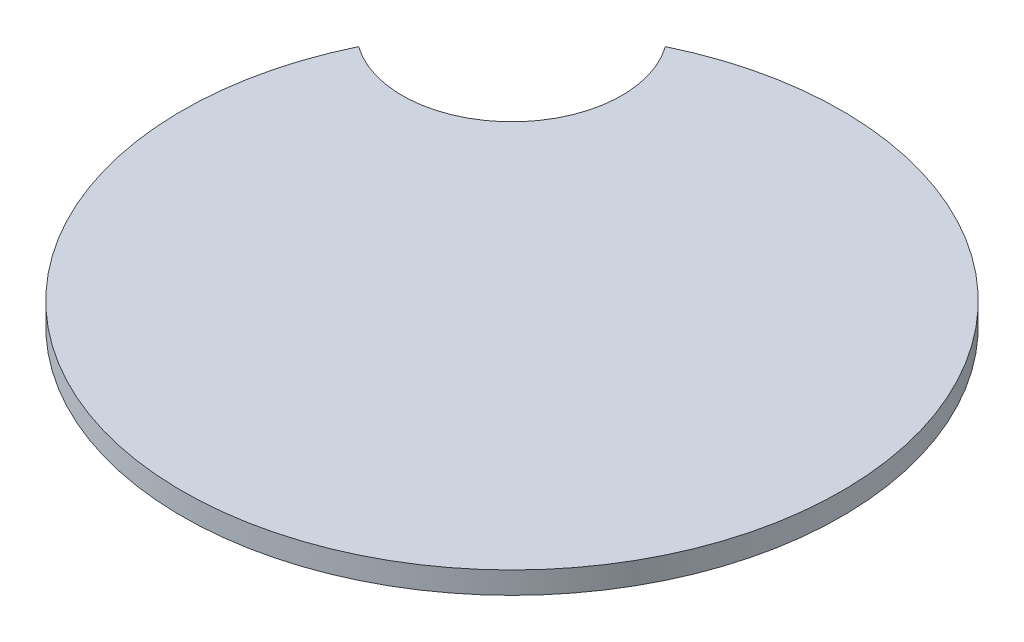
ISO-10303-21;
HEADER;
FILE_DESCRIPTION(('STEP AP214'),'2;1');
FILE_NAME('part.step','',(''),(''),'','','');
FILE_SCHEMA(('AUTOMOTIVE_DESIGN { 1 0 10303 214 1 1 1 1 }'));
ENDSEC;
DATA;
#1=APPLICATION_CONTEXT('core data for automotive mechanical design processes');
#2=APPLICATION_PROTOCOL_DEFINITION('international standard','automotive_design',2000,#1);
#3=PRODUCT_CONTEXT('',#1,'mechanical');
#4=PRODUCT('Part','Part','',(#3));
#5=PRODUCT_RELATED_PRODUCT_CATEGORY('part','',(#4));
#6=PRODUCT_DEFINITION_FORMATION('','',#4);
#7=PRODUCT_DEFINITION_CONTEXT('part definition',#1,'design');
#8=PRODUCT_DEFINITION('design','',#6,#7);
#9=PRODUCT_DEFINITION_SHAPE('','',#8);
#10=(LENGTH_UNIT() NAMED_UNIT(*) SI_UNIT(.MILLI.,.METRE.));
#11=(NAMED_UNIT(*) PLANE_ANGLE_UNIT() SI_UNIT($,.RADIAN.));
#12=(NAMED_UNIT(*) SI_UNIT($,.STERADIAN.) SOLID_ANGLE_UNIT());
#13=UNCERTAINTY_MEASURE_WITH_UNIT(LENGTH_MEASURE(1.E-05),#10,'distance_accuracy_value','');
#14=(GEOMETRIC_REPRESENTATION_CONTEXT(3) GLOBAL_UNCERTAINTY_ASSIGNED_CONTEXT((#13)) GLOBAL_UNIT_ASSIGNED_CONTEXT((#10,
#11,#12)) REPRESENTATION_CONTEXT('',''));
#15=CARTESIAN_POINT('',(0.,0.,0.));
#16=DIRECTION('',(0.,0.,1.));
#17=DIRECTION('',(1.,0.,0.));
#18=AXIS2_PLACEMENT_3D('',#15,#16,#17);
#19=CARTESIAN_POINT('',(0.,0.,0.));
#20=DIRECTION('',(0.,1.,0.));
#21=DIRECTION('',(0.,0.,1.));
#22=AXIS2_PLACEMENT_3D('',#19,#20,#21);
#23=PLANE('',#22);
#24=CARTESIAN_POINT('',(0.0355018442779152,0.,-0.0159098676152181));
#25=DIRECTION('',(0.,-1.,0.));
#26=DIRECTION('',(0.,0.,1.));
#27=AXIS2_PLACEMENT_3D('',#24,#25,#26);
#28=CIRCLE('',#27,13.0173648301613);
#29=CARTESIAN_POINT('',(-12.9818628640904,0.,-0.0176905546093267));
#30=VERTEX_POINT('',#29);
#31=CARTESIAN_POINT('',(-11.4580261500965,0.,-6.12742370332329));
#32=VERTEX_POINT('',#31);
#33=EDGE_CURVE('E255',#30,#32,#28,.T.);
#34=ORIENTED_EDGE('',*,*,#33,.F.);
#35=DIRECTION('',(-1.,0.,0.));
#36=VECTOR('',#35,1.);
#37=CARTESIAN_POINT('',(-12.7318586260825,0.,-0.0176905546093267));
#38=LINE('',#37,#36);
#39=CARTESIAN_POINT('',(-12.7318586260825,0.,-0.0176905546093267));
#40=VERTEX_POINT('',#39);
#41=EDGE_CURVE('E264',#40,#30,#38,.T.);
#42=ORIENTED_EDGE('',*,*,#41,.F.);
#43=CARTESIAN_POINT('',(0.0355018442779152,0.,-0.0159098676152181));
#44=DIRECTION('',(0.,1.,0.));
#45=DIRECTION('',(0.,0.,1.));
#46=AXIS2_PLACEMENT_3D('',#43,#44,#45);
#47=CIRCLE('',#46,12.7673605945383);
#48=CARTESIAN_POINT('',(-11.233808220757,0.,-6.01658876329622));
#49=VERTEX_POINT('',#48);
#50=EDGE_CURVE('E261',#49,#40,#47,.T.);
#51=ORIENTED_EDGE('',*,*,#50,.F.);
#52=DIRECTION('',(0.896455401398766,0.,0.443133967670024));
#53=VECTOR('',#52,1.);
#54=CARTESIAN_POINT('',(-11.233808220757,0.,-6.01658876329622));
#55=LINE('',#54,#53);
#56=EDGE_CURVE('E258',#32,#49,#55,.T.);
#57=ORIENTED_EDGE('',*,*,#56,.F.);
#58=EDGE_LOOP('',(#34,#42,#51,#57));
#59=FACE_BOUND('',#58,.T.);
#60=CARTESIAN_POINT('',(0.,0.,0.));
#61=DIRECTION('',(0.,-1.,0.));
#62=DIRECTION('',(0.,0.,1.));
#63=AXIS2_PLACEMENT_3D('',#60,#61,#62);
#64=CIRCLE('',#63,13.);
#65=CARTESIAN_POINT('',(13.,0.,0.));
#66=VERTEX_POINT('',#65);
#67=CARTESIAN_POINT('',(11.4748054820771,0.,6.10973314871397));
#68=VERTEX_POINT('',#67);
#69=EDGE_CURVE('E309',#66,#68,#64,.T.);
#70=ORIENTED_EDGE('',*,*,#69,.F.);
#71=DIRECTION('',(1.,0.,0.));
#72=VECTOR('',#71,1.);
#73=CARTESIAN_POINT('',(12.75,0.,0.));
#74=LINE('',#73,#72);
#75=CARTESIAN_POINT('',(12.75,0.,0.));
#76=VERTEX_POINT('',#75);
#77=EDGE_CURVE('E318',#76,#66,#74,.T.);
#78=ORIENTED_EDGE('',*,*,#77,.F.);
#79=CARTESIAN_POINT('',(0.,0.,0.));
#80=DIRECTION('',(0.,1.,0.));
#81=DIRECTION('',(0.,0.,1.));
#82=AXIS2_PLACEMENT_3D('',#79,#80,#81);
#83=CIRCLE('',#82,12.75);
#84=CARTESIAN_POINT('',(11.2505875527375,0.,5.9988982086869));
#85=VERTEX_POINT('',#84);
#86=EDGE_CURVE('E315',#85,#76,#83,.T.);
#87=ORIENTED_EDGE('',*,*,#86,.F.);
#88=DIRECTION('',(-0.896455401398763,0.,-0.443133967670029));
#89=VECTOR('',#88,1.);
#90=CARTESIAN_POINT('',(11.2505875527375,0.,5.9988982086869));
#91=LINE('',#90,#89);
#92=EDGE_CURVE('E312',#68,#85,#91,.T.);
#93=ORIENTED_EDGE('',*,*,#92,.F.);
#94=EDGE_LOOP('',(#70,#78,#87,#93));
#95=FACE_BOUND('',#94,.T.);
#96=CARTESIAN_POINT('',(0.,0.,0.));
#97=DIRECTION('',(0.,1.,0.));
#98=DIRECTION('',(0.,0.,1.));
#99=AXIS2_PLACEMENT_3D('',#96,#97,#98);
#100=CIRCLE('',#99,30.);
#101=CARTESIAN_POINT('',(-27.0106016079316,0.,-13.0547845933053));
#102=VERTEX_POINT('',#101);
#103=CARTESIAN_POINT('',(-13.054784593305,0.,-27.0106016079318));
#104=VERTEX_POINT('',#103);
#105=EDGE_CURVE('E437',#102,#104,#100,.T.);
#106=ORIENTED_EDGE('',*,*,#105,.F.);
#107=CARTESIAN_POINT('',(-21.1767179533052,0.,-21.1767179533055));
#108=DIRECTION('',(0.,-1.,0.));
#109=DIRECTION('',(0.,0.,-1.));
#110=AXIS2_PLACEMENT_3D('',#107,#108,#109);
#111=CIRCLE('',#110,10.);
#112=EDGE_CURVE('E339',#104,#102,#111,.T.);
#113=ORIENTED_EDGE('',*,*,#112,.F.);
#114=EDGE_LOOP('',(#106,#113));
#115=FACE_BOUND('',#114,.T.);
#116=DIRECTION('',(0.707106781186547,0.,0.707106781186548));
#117=VECTOR('',#116,1.);
#118=CARTESIAN_POINT('',(0.,0.,0.));
#119=LINE('',#118,#117);
#120=CARTESIAN_POINT('',(-9.19238815542513,0.,-9.19238815542516));
#121=VERTEX_POINT('',#120);
#122=CARTESIAN_POINT('',(-7.07106781186546,0.,-7.07106781186549));
#123=VERTEX_POINT('',#122);
#124=EDGE_CURVE('E362',#121,#123,#119,.T.);
#125=ORIENTED_EDGE('',*,*,#124,.F.);
#126=CARTESIAN_POINT('',(0.,0.,0.));
#127=DIRECTION('',(0.,1.,0.));
#128=DIRECTION('',(0.,0.,1.));
#129=AXIS2_PLACEMENT_3D('',#126,#127,#128);
#130=CIRCLE('',#129,13.);
#131=CARTESIAN_POINT('',(-10.057468336274,0.,-8.23694911146399));
#132=VERTEX_POINT('',#131);
#133=EDGE_CURVE('E359',#132,#121,#130,.F.);
#134=ORIENTED_EDGE('',*,*,#133,.F.);
#135=DIRECTION('',(-0.774898549778318,0.,-0.632085625173883));
#136=VECTOR('',#135,1.);
#137=CARTESIAN_POINT('',(0.0161932499756489,0.,-0.0198519400261257));
#138=LINE('',#137,#136);
#139=CARTESIAN_POINT('',(-7.73276681866139,0.,-6.34068744918163));
#140=VERTEX_POINT('',#139);
#141=EDGE_CURVE('E356',#140,#132,#138,.T.);
#142=ORIENTED_EDGE('',*,*,#141,.F.);
#143=CARTESIAN_POINT('',(0.,0.,0.));
#144=DIRECTION('',(0.,1.,0.));
#145=DIRECTION('',(0.,0.,1.));
#146=AXIS2_PLACEMENT_3D('',#143,#144,#145);
#147=CIRCLE('',#146,10.);
#148=CARTESIAN_POINT('',(7.07106781186546,0.,7.07106781186549));
#149=VERTEX_POINT('',#148);
#150=EDGE_CURVE('E441',#140,#149,#147,.T.);
#151=ORIENTED_EDGE('',*,*,#150,.T.);
#152=DIRECTION('',(-0.707106781186551,0.,-0.707106781186544));
#153=VECTOR('',#152,1.);
#154=CARTESIAN_POINT('',(0.,0.,0.));
#155=LINE('',#154,#153);
#156=CARTESIAN_POINT('',(9.19238815542511,0.,9.19238815542512));
#157=VERTEX_POINT('',#156);
#158=EDGE_CURVE('E378',#157,#149,#155,.T.);
#159=ORIENTED_EDGE('',*,*,#158,.F.);
#160=CARTESIAN_POINT('',(0.,0.,0.));
#161=DIRECTION('',(0.,1.,0.));
#162=DIRECTION('',(0.,0.,1.));
#163=AXIS2_PLACEMENT_3D('',#160,#161,#162);
#164=CIRCLE('',#163,13.);
#165=CARTESIAN_POINT('',(10.0765219435879,0.,8.21362925389202));
#166=VERTEX_POINT('',#165);
#167=EDGE_CURVE('E375',#166,#157,#164,.F.);
#168=ORIENTED_EDGE('',*,*,#167,.F.);
#169=DIRECTION('',(0.779628738922517,0.,0.626241989526481));
#170=VECTOR('',#169,1.);
#171=CARTESIAN_POINT('',(-0.0583909707666999,0.,0.0726927923464941));
#172=LINE('',#171,#170);
#173=CARTESIAN_POINT('',(7.73755751632147,0.,6.33484046220717));
#174=VERTEX_POINT('',#173);
#175=EDGE_CURVE('E373',#174,#166,#172,.T.);
#176=ORIENTED_EDGE('',*,*,#175,.F.);
#177=EDGE_CURVE('E444',#174,#123,#147,.T.);
#178=ORIENTED_EDGE('',*,*,#177,.T.);
#179=EDGE_LOOP('',(#125,#134,#142,#151,#159,#168,#176,#178));
#180=FACE_BOUND('',#179,.T.);
#181=CARTESIAN_POINT('',(0.,0.,0.));
#182=DIRECTION('',(0.,-1.,0.));
#183=DIRECTION('',(0.,0.,1.));
#184=AXIS2_PLACEMENT_3D('',#181,#182,#183);
#185=CIRCLE('',#184,13.);
#186=CARTESIAN_POINT('',(9.73079728808347,0.,-8.62041670328223));
#187=VERTEX_POINT('',#186);
#188=CARTESIAN_POINT('',(12.8439687956296,0.,-2.00809999175636));
#189=VERTEX_POINT('',#188);
#190=EDGE_CURVE('E279',#187,#189,#185,.T.);
#191=ORIENTED_EDGE('',*,*,#190,.F.);
#192=DIRECTION('',(0.780925324420643,0.,-0.624624397280888));
#193=VECTOR('',#192,1.);
#194=CARTESIAN_POINT('',(9.53531372044164,0.,-8.46405885215583));
#195=LINE('',#194,#193);
#196=CARTESIAN_POINT('',(9.53531372044164,0.,-8.46405885215583));
#197=VERTEX_POINT('',#196);
#198=EDGE_CURVE('E288',#197,#187,#195,.T.);
#199=ORIENTED_EDGE('',*,*,#198,.F.);
#200=CARTESIAN_POINT('',(0.,0.,0.));
#201=DIRECTION('',(0.,1.,0.));
#202=DIRECTION('',(0.,0.,1.));
#203=AXIS2_PLACEMENT_3D('',#200,#201,#202);
#204=CIRCLE('',#203,12.75);
#205=CARTESIAN_POINT('',(12.5963800811572,0.,-1.9732482993852));
#206=VERTEX_POINT('',#205);
#207=EDGE_CURVE('E285',#206,#197,#204,.T.);
#208=ORIENTED_EDGE('',*,*,#207,.F.);
#209=DIRECTION('',(-0.990237525692838,0.,0.139390253280945));
#210=VECTOR('',#209,1.);
#211=CARTESIAN_POINT('',(12.5963800811572,0.,-1.9732482993852));
#212=LINE('',#211,#210);
#213=EDGE_CURVE('E282',#189,#206,#212,.T.);
#214=ORIENTED_EDGE('',*,*,#213,.F.);
#215=EDGE_LOOP('',(#191,#199,#208,#214));
#216=FACE_BOUND('',#215,.T.);
#217=CARTESIAN_POINT('',(0.0355018442779152,0.,-0.0159098676152181));
#218=DIRECTION('',(0.,-1.,0.));
#219=DIRECTION('',(0.,0.,1.));
#220=AXIS2_PLACEMENT_3D('',#217,#218,#219);
#221=CIRCLE('',#220,13.0260712342571);
#222=CARTESIAN_POINT('',(-9.72209654969822,0.,8.61356319751537));
#223=VERTEX_POINT('',#222);
#224=CARTESIAN_POINT('',(-12.8336417967827,0.,1.99994571890087));
#225=VERTEX_POINT('',#224);
#226=EDGE_CURVE('E229',#223,#225,#221,.T.);
#227=ORIENTED_EDGE('',*,*,#226,.F.);
#228=DIRECTION('',(-0.780925324420648,0.,0.624624397280882));
#229=VECTOR('',#228,1.);
#230=CARTESIAN_POINT('',(-9.52662227898585,0.,8.4572127825532));
#231=LINE('',#230,#229);
#232=CARTESIAN_POINT('',(-9.52662227898586,0.,8.45721278255321));
#233=VERTEX_POINT('',#232);
#234=EDGE_CURVE('E232',#233,#223,#231,.T.);
#235=ORIENTED_EDGE('',*,*,#234,.F.);
#236=CARTESIAN_POINT('',(0.0355018442779152,0.,-0.0159098676152181));
#237=DIRECTION('',(0.,1.,0.));
#238=DIRECTION('',(0.,0.,1.));
#239=AXIS2_PLACEMENT_3D('',#236,#237,#238);
#240=CIRCLE('',#239,12.7760723696095);
#241=CARTESIAN_POINT('',(-12.5860530823103,0.,1.96509402652972));
#242=VERTEX_POINT('',#241);
#243=EDGE_CURVE('E55',#242,#233,#240,.T.);
#244=ORIENTED_EDGE('',*,*,#243,.F.);
#245=DIRECTION('',(0.990237525692839,0.,-0.139390253280937));
#246=VECTOR('',#245,1.);
#247=CARTESIAN_POINT('',(-12.5860530823103,0.,1.96509402652972));
#248=LINE('',#247,#246);
#249=EDGE_CURVE('E50',#225,#242,#248,.T.);
#250=ORIENTED_EDGE('',*,*,#249,.F.);
#251=EDGE_LOOP('',(#227,#235,#244,#250));
#252=FACE_BOUND('',#251,.T.);
#253=ADVANCED_FACE('F35',(#59,#95,#115,#180,#216,#252),#23,.F.);
#254=CARTESIAN_POINT('',(0.,-2.,0.));
#255=DIRECTION('',(0.,-1.,0.));
#256=DIRECTION('',(0.,0.,-1.));
#257=AXIS2_PLACEMENT_3D('',#254,#255,#256);
#258=PLANE('',#257);
#259=CARTESIAN_POINT('',(0.0355018442779152,-2.,-0.0159098676152181));
#260=DIRECTION('',(0.,-1.,0.));
#261=DIRECTION('',(0.,0.,-1.));
#262=AXIS2_PLACEMENT_3D('',#259,#260,#261);
#263=CIRCLE('',#262,13.0173648301613);
#264=CARTESIAN_POINT('',(-11.4580261500965,-2.,-6.12742370332329));
#265=VERTEX_POINT('',#264);
#266=CARTESIAN_POINT('',(-12.9818628640904,-2.,-0.0176905546093267));
#267=VERTEX_POINT('',#266);
#268=EDGE_CURVE('E464',#265,#267,#263,.F.);
#269=ORIENTED_EDGE('',*,*,#268,.F.);
#270=DIRECTION('',(-0.896455401398766,0.,-0.443133967670024));
#271=VECTOR('',#270,1.);
#272=CARTESIAN_POINT('',(0.184131684718439,-2.,-0.3724964804716));
#273=LINE('',#272,#271);
#274=CARTESIAN_POINT('',(-11.233808220757,-2.,-6.01658876329622));
#275=VERTEX_POINT('',#274);
#276=EDGE_CURVE('E461',#275,#265,#273,.T.);
#277=ORIENTED_EDGE('',*,*,#276,.F.);
#278=CARTESIAN_POINT('',(0.0355018442779152,-2.,-0.0159098676152181));
#279=DIRECTION('',(0.,-1.,0.));
#280=DIRECTION('',(0.,0.,-1.));
#281=AXIS2_PLACEMENT_3D('',#278,#279,#280);
#282=CIRCLE('',#281,12.7673605945383);
#283=CARTESIAN_POINT('',(-12.7318586260825,-2.,-0.0176905546093267));
#284=VERTEX_POINT('',#283);
#285=EDGE_CURVE('E458',#284,#275,#282,.T.);
#286=ORIENTED_EDGE('',*,*,#285,.F.);
#287=DIRECTION('',(1.,0.,0.));
#288=VECTOR('',#287,1.);
#289=CARTESIAN_POINT('',(0.,-2.,-0.0176905546093267));
#290=LINE('',#289,#288);
#291=EDGE_CURVE('E455',#267,#284,#290,.T.);
#292=ORIENTED_EDGE('',*,*,#291,.F.);
#293=EDGE_LOOP('',(#269,#277,#286,#292));
#294=FACE_BOUND('',#293,.T.);
#295=DIRECTION('',(0.774898549778319,0.,0.632085625173883));
#296=VECTOR('',#295,1.);
#297=CARTESIAN_POINT('',(-10.057468336274,-2.,-8.23694911146399));
#298=LINE('',#297,#296);
#299=CARTESIAN_POINT('',(-10.057468336274,-2.,-8.23694911146399));
#300=VERTEX_POINT('',#299);
#301=CARTESIAN_POINT('',(-7.73276681866139,-2.,-6.34068744918163));
#302=VERTEX_POINT('',#301);
#303=EDGE_CURVE('E347',#300,#302,#298,.T.);
#304=ORIENTED_EDGE('',*,*,#303,.F.);
#305=CARTESIAN_POINT('',(0.,-2.,0.));
#306=DIRECTION('',(0.,-1.,0.));
#307=DIRECTION('',(0.,0.,-1.));
#308=AXIS2_PLACEMENT_3D('',#305,#306,#307);
#309=CIRCLE('',#308,13.);
#310=CARTESIAN_POINT('',(-9.19238815542516,-2.,9.19238815542512));
#311=VERTEX_POINT('',#310);
#312=EDGE_CURVE('E385',#311,#300,#309,.T.);
#313=ORIENTED_EDGE('',*,*,#312,.F.);
#314=DIRECTION('',(-0.707106781186549,0.,0.707106781186546));
#315=VECTOR('',#314,1.);
#316=CARTESIAN_POINT('',(-7.07106781186549,-2.,7.07106781186546));
#317=LINE('',#316,#315);
#318=CARTESIAN_POINT('',(-7.07106781186549,-2.,7.07106781186546));
#319=VERTEX_POINT('',#318);
#320=EDGE_CURVE('E392',#319,#311,#317,.T.);
#321=ORIENTED_EDGE('',*,*,#320,.F.);
#322=CARTESIAN_POINT('',(0.,-2.,0.));
#323=DIRECTION('',(0.,1.,0.));
#324=DIRECTION('',(0.,0.,-1.));
#325=AXIS2_PLACEMENT_3D('',#322,#323,#324);
#326=CIRCLE('',#325,10.);
#327=EDGE_CURVE('E381',#302,#319,#326,.T.);
#328=ORIENTED_EDGE('',*,*,#327,.F.);
#329=EDGE_LOOP('',(#304,#313,#321,#328));
#330=FACE_BOUND('',#329,.T.);
#331=CARTESIAN_POINT('',(0.0355018442779152,-2.,-0.0159098676152181));
#332=DIRECTION('',(0.,-1.,0.));
#333=DIRECTION('',(0.,0.,-1.));
#334=AXIS2_PLACEMENT_3D('',#331,#332,#333);
#335=CIRCLE('',#334,13.0260712342571);
#336=CARTESIAN_POINT('',(-12.8336417967827,-2.,1.99994571890087));
#337=VERTEX_POINT('',#336);
#338=CARTESIAN_POINT('',(-9.72209654969822,-2.,8.61356319751537));
#339=VERTEX_POINT('',#338);
#340=EDGE_CURVE('E11',#337,#339,#335,.F.);
#341=ORIENTED_EDGE('',*,*,#340,.F.);
#342=DIRECTION('',(-0.990237525692839,0.,0.139390253280937));
#343=VECTOR('',#342,1.);
#344=CARTESIAN_POINT('',(0.0266983518623855,-2.,0.189666847329712));
#345=LINE('',#344,#343);
#346=CARTESIAN_POINT('',(-12.5860530823103,-2.,1.96509402652972));
#347=VERTEX_POINT('',#346);
#348=EDGE_CURVE('E43',#347,#337,#345,.T.);
#349=ORIENTED_EDGE('',*,*,#348,.F.);
#350=CARTESIAN_POINT('',(0.0355018442779152,-2.,-0.0159098676152181));
#351=DIRECTION('',(0.,-1.,0.));
#352=DIRECTION('',(0.,0.,-1.));
#353=AXIS2_PLACEMENT_3D('',#350,#351,#352);
#354=CIRCLE('',#353,12.7760723696095);
#355=CARTESIAN_POINT('',(-9.52662227898586,-2.,8.45721278255319));
#356=VERTEX_POINT('',#355);
#357=EDGE_CURVE('E469',#356,#347,#354,.T.);
#358=ORIENTED_EDGE('',*,*,#357,.F.);
#359=DIRECTION('',(0.780925324420648,0.,-0.624624397280882));
#360=VECTOR('',#359,1.);
#361=CARTESIAN_POINT('',(0.40843623227092,-2.,0.510639991937243));
#362=LINE('',#361,#360);
#363=EDGE_CURVE('E467',#339,#356,#362,.T.);
#364=ORIENTED_EDGE('',*,*,#363,.F.);
#365=EDGE_LOOP('',(#341,#349,#358,#364));
#366=FACE_BOUND('',#365,.T.);
#367=ADVANCED_FACE('F476',(#294,#330,#366),#258,.F.);
#368=CARTESIAN_POINT('',(0.,-2.,0.));
#369=DIRECTION('',(0.,1.,0.));
#370=DIRECTION('',(0.,0.,1.));
#371=AXIS2_PLACEMENT_3D('',#368,#369,#370);
#372=PLANE('',#371);
#373=CARTESIAN_POINT('',(0.,-2.,0.));
#374=DIRECTION('',(0.,-1.,0.));
#375=DIRECTION('',(0.,0.,1.));
#376=AXIS2_PLACEMENT_3D('',#373,#374,#375);
#377=CIRCLE('',#376,13.);
#378=CARTESIAN_POINT('',(12.8439687956296,-2.,-2.00809999175636));
#379=VERTEX_POINT('',#378);
#380=CARTESIAN_POINT('',(13.,-2.,0.));
#381=VERTEX_POINT('',#380);
#382=EDGE_CURVE('E420',#379,#381,#377,.T.);
#383=ORIENTED_EDGE('',*,*,#382,.F.);
#384=DIRECTION('',(-0.990237525692838,0.,0.139390253280945));
#385=VECTOR('',#384,1.);
#386=CARTESIAN_POINT('',(-0.0276232318394915,-2.,-0.196237255507714));
#387=LINE('',#386,#385);
#388=CARTESIAN_POINT('',(12.5963800811572,-2.,-1.9732482993852));
#389=VERTEX_POINT('',#388);
#390=EDGE_CURVE('E306',#379,#389,#387,.T.);
#391=ORIENTED_EDGE('',*,*,#390,.T.);
#392=CARTESIAN_POINT('',(0.,-2.,0.));
#393=DIRECTION('',(0.,1.,0.));
#394=DIRECTION('',(0.,0.,1.));
#395=AXIS2_PLACEMENT_3D('',#392,#393,#394);
#396=CIRCLE('',#395,12.75);
#397=CARTESIAN_POINT('',(9.53531372044164,-2.,-8.46405885215583));
#398=VERTEX_POINT('',#397);
#399=EDGE_CURVE('E452',#389,#398,#396,.T.);
#400=ORIENTED_EDGE('',*,*,#399,.T.);
#401=DIRECTION('',(0.780925324420643,0.,-0.624624397280888));
#402=VECTOR('',#401,1.);
#403=CARTESIAN_POINT('',(-0.408384627517515,-2.,-0.510575474030203));
#404=LINE('',#403,#402);
#405=CARTESIAN_POINT('',(9.73079728808347,-2.,-8.62041670328223));
#406=VERTEX_POINT('',#405);
#407=EDGE_CURVE('E303',#398,#406,#404,.T.);
#408=ORIENTED_EDGE('',*,*,#407,.T.);
#409=CARTESIAN_POINT('',(9.19238815542512,-2.,-9.19238815542511));
#410=VERTEX_POINT('',#409);
#411=EDGE_CURVE('E416',#410,#406,#377,.T.);
#412=ORIENTED_EDGE('',*,*,#411,.F.);
#413=DIRECTION('',(0.707106781186544,0.,-0.707106781186551));
#414=VECTOR('',#413,1.);
#415=CARTESIAN_POINT('',(7.07106781186549,-2.,-7.07106781186546));
#416=LINE('',#415,#414);
#417=CARTESIAN_POINT('',(7.07106781186549,-2.,-7.07106781186546));
#418=VERTEX_POINT('',#417);
#419=EDGE_CURVE('E410',#418,#410,#416,.T.);
#420=ORIENTED_EDGE('',*,*,#419,.F.);
#421=CARTESIAN_POINT('',(0.,-2.,0.));
#422=DIRECTION('',(0.,1.,0.));
#423=DIRECTION('',(0.,0.,1.));
#424=AXIS2_PLACEMENT_3D('',#421,#422,#423);
#425=CIRCLE('',#424,10.);
#426=CARTESIAN_POINT('',(7.73755751632147,-2.,6.33484046220717));
#427=VERTEX_POINT('',#426);
#428=EDGE_CURVE('E419',#427,#418,#425,.T.);
#429=ORIENTED_EDGE('',*,*,#428,.F.);
#430=DIRECTION('',(-0.779628738922517,0.,-0.626241989526481));
#431=VECTOR('',#430,1.);
#432=CARTESIAN_POINT('',(10.0765219435879,-2.,8.21362925389202));
#433=LINE('',#432,#431);
#434=CARTESIAN_POINT('',(10.0765219435879,-2.,8.21362925389202));
#435=VERTEX_POINT('',#434);
#436=EDGE_CURVE('E365',#435,#427,#433,.T.);
#437=ORIENTED_EDGE('',*,*,#436,.F.);
#438=CARTESIAN_POINT('',(11.4748054820771,-2.,6.10973314871397));
#439=VERTEX_POINT('',#438);
#440=EDGE_CURVE('E405',#439,#435,#377,.T.);
#441=ORIENTED_EDGE('',*,*,#440,.F.);
#442=DIRECTION('',(-0.896455401398763,0.,-0.443133967670029));
#443=VECTOR('',#442,1.);
#444=CARTESIAN_POINT('',(-0.173809195698718,-2.,0.35161419269243));
#445=LINE('',#444,#443);
#446=CARTESIAN_POINT('',(11.2505875527375,-2.,5.9988982086869));
#447=VERTEX_POINT('',#446);
#448=EDGE_CURVE('E336',#439,#447,#445,.T.);
#449=ORIENTED_EDGE('',*,*,#448,.T.);
#450=CARTESIAN_POINT('',(0.,-2.,0.));
#451=DIRECTION('',(0.,1.,0.));
#452=DIRECTION('',(0.,0.,1.));
#453=AXIS2_PLACEMENT_3D('',#450,#451,#452);
#454=CIRCLE('',#453,12.75);
#455=CARTESIAN_POINT('',(12.75,-2.,0.));
#456=VERTEX_POINT('',#455);
#457=EDGE_CURVE('E449',#447,#456,#454,.T.);
#458=ORIENTED_EDGE('',*,*,#457,.T.);
#459=DIRECTION('',(1.,0.,0.));
#460=VECTOR('',#459,1.);
#461=CARTESIAN_POINT('',(0.,-2.,0.));
#462=LINE('',#461,#460);
#463=EDGE_CURVE('E333',#456,#381,#462,.T.);
#464=ORIENTED_EDGE('',*,*,#463,.T.);
#465=EDGE_LOOP('',(#383,#391,#400,#408,#412,#420,#429,#437,#441,#449,#458,#464));
#466=FACE_BOUND('',#465,.T.);
#467=ADVANCED_FACE('F493',(#466),#372,.T.);
#468=CARTESIAN_POINT('',(0.,-2.,0.));
#469=DIRECTION('',(0.,1.,0.));
#470=DIRECTION('',(0.,0.,1.));
#471=AXIS2_PLACEMENT_3D('',#468,#469,#470);
#472=CYLINDRICAL_SURFACE('',#471,10.);
#473=DIRECTION('',(0.,1.,0.));
#474=VECTOR('',#473,1.);
#475=CARTESIAN_POINT('',(-7.07106781186546,-4.,-7.07106781186549));
#476=LINE('',#475,#474);
#477=CARTESIAN_POINT('',(-7.07106781186546,-4.,-7.07106781186549));
#478=VERTEX_POINT('',#477);
#479=EDGE_CURVE('E390',#478,#123,#476,.T.);
#480=ORIENTED_EDGE('',*,*,#479,.T.);
#481=ORIENTED_EDGE('',*,*,#177,.F.);
#482=DIRECTION('',(0.,-1.,0.));
#483=VECTOR('',#482,1.);
#484=CARTESIAN_POINT('',(7.73755751632147,1.,6.33484046220717));
#485=LINE('',#484,#483);
#486=EDGE_CURVE('E367',#174,#427,#485,.T.);
#487=ORIENTED_EDGE('',*,*,#486,.T.);
#488=ORIENTED_EDGE('',*,*,#428,.T.);
#489=DIRECTION('',(0.,1.,0.));
#490=VECTOR('',#489,1.);
#491=CARTESIAN_POINT('',(7.07106781186549,-4.,-7.07106781186546));
#492=LINE('',#491,#490);
#493=CARTESIAN_POINT('',(7.07106781186549,-4.,-7.07106781186546));
#494=VERTEX_POINT('',#493);
#495=EDGE_CURVE('E425',#494,#418,#492,.T.);
#496=ORIENTED_EDGE('',*,*,#495,.F.);
#497=CARTESIAN_POINT('',(0.,-4.,0.));
#498=DIRECTION('',(0.,-1.,0.));
#499=DIRECTION('',(0.,0.,-1.));
#500=AXIS2_PLACEMENT_3D('',#497,#498,#499);
#501=CIRCLE('',#500,10.);
#502=EDGE_CURVE('E433',#478,#494,#501,.T.);
#503=ORIENTED_EDGE('',*,*,#502,.F.);
#504=EDGE_LOOP('',(#480,#481,#487,#488,#496,#503));
#505=FACE_BOUND('',#504,.T.);
#506=ADVANCED_FACE('F37',(#505),#472,.T.);
#507=ORIENTED_EDGE('',*,*,#150,.F.);
#508=DIRECTION('',(0.,-1.,0.));
#509=VECTOR('',#508,1.);
#510=CARTESIAN_POINT('',(-7.73276681866139,1.,-6.34068744918163));
#511=LINE('',#510,#509);
#512=EDGE_CURVE('E350',#140,#302,#511,.T.);
#513=ORIENTED_EDGE('',*,*,#512,.T.);
#514=ORIENTED_EDGE('',*,*,#327,.T.);
#515=DIRECTION('',(0.,1.,0.));
#516=VECTOR('',#515,1.);
#517=CARTESIAN_POINT('',(-7.07106781186549,-4.,7.07106781186546));
#518=LINE('',#517,#516);
#519=CARTESIAN_POINT('',(-7.07106781186549,-4.,7.07106781186546));
#520=VERTEX_POINT('',#519);
#521=EDGE_CURVE('E402',#520,#319,#518,.T.);
#522=ORIENTED_EDGE('',*,*,#521,.F.);
#523=CARTESIAN_POINT('',(7.07106781186546,-4.,7.07106781186549));
#524=VERTEX_POINT('',#523);
#525=EDGE_CURVE('E434',#524,#520,#501,.T.);
#526=ORIENTED_EDGE('',*,*,#525,.F.);
#527=DIRECTION('',(0.,1.,0.));
#528=VECTOR('',#527,1.);
#529=CARTESIAN_POINT('',(7.07106781186546,-4.,7.07106781186549));
#530=LINE('',#529,#528);
#531=EDGE_CURVE('E428',#524,#149,#530,.T.);
#532=ORIENTED_EDGE('',*,*,#531,.T.);
#533=EDGE_LOOP('',(#507,#513,#514,#522,#526,#532));
#534=FACE_BOUND('',#533,.T.);
#535=ADVANCED_FACE('F502',(#534),#472,.T.);
#536=CARTESIAN_POINT('',(0.,2.,0.));
#537=DIRECTION('',(0.,-1.,0.));
#538=DIRECTION('',(0.,0.,-1.));
#539=AXIS2_PLACEMENT_3D('',#536,#537,#538);
#540=CYLINDRICAL_SURFACE('',#539,30.);
#541=ORIENTED_EDGE('',*,*,#105,.T.);
#542=DIRECTION('',(0.,-1.,0.));
#543=VECTOR('',#542,1.);
#544=CARTESIAN_POINT('',(-13.054784593305,5.,-27.0106016079318));
#545=LINE('',#544,#543);
#546=CARTESIAN_POINT('',(-13.054784593305,2.,-27.0106016079318));
#547=VERTEX_POINT('',#546);
#548=EDGE_CURVE('E344',#104,#547,#545,.F.);
#549=ORIENTED_EDGE('',*,*,#548,.T.);
#550=CARTESIAN_POINT('',(0.,2.,0.));
#551=DIRECTION('',(0.,1.,0.));
#552=DIRECTION('',(0.,0.,1.));
#553=AXIS2_PLACEMENT_3D('',#550,#551,#552);
#554=CIRCLE('',#553,30.);
#555=CARTESIAN_POINT('',(-27.0106016079316,2.,-13.0547845933053));
#556=VERTEX_POINT('',#555);
#557=EDGE_CURVE('E438',#556,#547,#554,.T.);
#558=ORIENTED_EDGE('',*,*,#557,.F.);
#559=DIRECTION('',(0.,-1.,0.));
#560=VECTOR('',#559,1.);
#561=CARTESIAN_POINT('',(-27.0106016079316,5.,-13.0547845933053));
#562=LINE('',#561,#560);
#563=EDGE_CURVE('E341',#556,#102,#562,.T.);
#564=ORIENTED_EDGE('',*,*,#563,.T.);
#565=EDGE_LOOP('',(#541,#549,#558,#564));
#566=FACE_BOUND('',#565,.T.);
#567=ADVANCED_FACE('F500',(#566),#540,.T.);
#568=CARTESIAN_POINT('',(0.,2.,0.));
#569=DIRECTION('',(0.,1.,0.));
#570=DIRECTION('',(0.,0.,1.));
#571=AXIS2_PLACEMENT_3D('',#568,#569,#570);
#572=PLANE('',#571);
#573=CARTESIAN_POINT('',(-21.1767179533052,2.,-21.1767179533055));
#574=DIRECTION('',(0.,1.,0.));
#575=DIRECTION('',(0.,0.,1.));
#576=AXIS2_PLACEMENT_3D('',#573,#574,#575);
#577=CIRCLE('',#576,10.);
#578=EDGE_CURVE('E447',#556,#547,#577,.T.);
#579=ORIENTED_EDGE('',*,*,#578,.F.);
#580=ORIENTED_EDGE('',*,*,#557,.T.);
#581=EDGE_LOOP('',(#579,#580));
#582=FACE_BOUND('',#581,.T.);
#583=ADVANCED_FACE('F498',(#582),#572,.T.);
#584=CARTESIAN_POINT('',(0.,-4.,0.));
#585=DIRECTION('',(0.,-1.,0.));
#586=DIRECTION('',(0.,0.,-1.));
#587=AXIS2_PLACEMENT_3D('',#584,#585,#586);
#588=PLANE('',#587);
#589=ORIENTED_EDGE('',*,*,#525,.T.);
#590=DIRECTION('',(-0.707106781186549,0.,0.707106781186546));
#591=VECTOR('',#590,1.);
#592=CARTESIAN_POINT('',(-7.07106781186549,-4.,7.07106781186546));
#593=LINE('',#592,#591);
#594=CARTESIAN_POINT('',(-9.19238815542516,-4.,9.19238815542512));
#595=VERTEX_POINT('',#594);
#596=EDGE_CURVE('E382',#520,#595,#593,.T.);
#597=ORIENTED_EDGE('',*,*,#596,.T.);
#598=CARTESIAN_POINT('',(0.,-4.,0.));
#599=DIRECTION('',(0.,-1.,0.));
#600=DIRECTION('',(0.,0.,-1.));
#601=AXIS2_PLACEMENT_3D('',#598,#599,#600);
#602=CIRCLE('',#601,13.);
#603=CARTESIAN_POINT('',(-9.19238815542513,-4.,-9.19238815542516));
#604=VERTEX_POINT('',#603);
#605=EDGE_CURVE('E384',#595,#604,#602,.T.);
#606=ORIENTED_EDGE('',*,*,#605,.T.);
#607=DIRECTION('',(0.707106781186546,0.,0.707106781186549));
#608=VECTOR('',#607,1.);
#609=CARTESIAN_POINT('',(-7.07106781186546,-4.,-7.07106781186549));
#610=LINE('',#609,#608);
#611=EDGE_CURVE('E387',#604,#478,#610,.T.);
#612=ORIENTED_EDGE('',*,*,#611,.T.);
#613=ORIENTED_EDGE('',*,*,#502,.T.);
#614=DIRECTION('',(0.707106781186544,0.,-0.707106781186551));
#615=VECTOR('',#614,1.);
#616=CARTESIAN_POINT('',(7.07106781186549,-4.,-7.07106781186546));
#617=LINE('',#616,#615);
#618=CARTESIAN_POINT('',(9.19238815542512,-4.,-9.19238815542511));
#619=VERTEX_POINT('',#618);
#620=EDGE_CURVE('E413',#494,#619,#617,.T.);
#621=ORIENTED_EDGE('',*,*,#620,.T.);
#622=CARTESIAN_POINT('',(0.,-4.,0.));
#623=DIRECTION('',(0.,-1.,0.));
#624=DIRECTION('',(0.,0.,1.));
#625=AXIS2_PLACEMENT_3D('',#622,#623,#624);
#626=CIRCLE('',#625,13.);
#627=CARTESIAN_POINT('',(9.19238815542511,-4.,9.19238815542512));
#628=VERTEX_POINT('',#627);
#629=EDGE_CURVE('E406',#619,#628,#626,.T.);
#630=ORIENTED_EDGE('',*,*,#629,.T.);
#631=DIRECTION('',(-0.707106781186551,0.,-0.707106781186544));
#632=VECTOR('',#631,1.);
#633=CARTESIAN_POINT('',(7.07106781186546,-4.,7.07106781186549));
#634=LINE('',#633,#632);
#635=EDGE_CURVE('E409',#628,#524,#634,.T.);
#636=ORIENTED_EDGE('',*,*,#635,.T.);
#637=EDGE_LOOP('',(#589,#597,#606,#612,#613,#621,#630,#636));
#638=FACE_BOUND('',#637,.T.);
#639=ADVANCED_FACE('F508',(#638),#588,.T.);
#640=CARTESIAN_POINT('',(0.,-4.,0.));
#641=DIRECTION('',(0.,1.,0.));
#642=DIRECTION('',(0.,0.,1.));
#643=AXIS2_PLACEMENT_3D('',#640,#641,#642);
#644=CYLINDRICAL_SURFACE('',#643,13.);
#645=ORIENTED_EDGE('',*,*,#411,.T.);
#646=DIRECTION('',(0.,1.,0.));
#647=VECTOR('',#646,1.);
#648=CARTESIAN_POINT('',(9.73079728808347,-3.,-8.62041670328223));
#649=LINE('',#648,#647);
#650=EDGE_CURVE('E291',#406,#187,#649,.T.);
#651=ORIENTED_EDGE('',*,*,#650,.T.);
#652=ORIENTED_EDGE('',*,*,#190,.T.);
#653=DIRECTION('',(0.,1.,0.));
#654=VECTOR('',#653,1.);
#655=CARTESIAN_POINT('',(12.8439687956296,-3.,-2.00809999175636));
#656=LINE('',#655,#654);
#657=EDGE_CURVE('E300',#379,#189,#656,.T.);
#658=ORIENTED_EDGE('',*,*,#657,.F.);
#659=ORIENTED_EDGE('',*,*,#382,.T.);
#660=DIRECTION('',(0.,1.,0.));
#661=VECTOR('',#660,1.);
#662=CARTESIAN_POINT('',(13.,-3.,0.));
#663=LINE('',#662,#661);
#664=EDGE_CURVE('E321',#381,#66,#663,.T.);
#665=ORIENTED_EDGE('',*,*,#664,.T.);
#666=ORIENTED_EDGE('',*,*,#69,.T.);
#667=DIRECTION('',(0.,1.,0.));
#668=VECTOR('',#667,1.);
#669=CARTESIAN_POINT('',(11.4748054820771,-3.,6.10973314871397));
#670=LINE('',#669,#668);
#671=EDGE_CURVE('E330',#439,#68,#670,.T.);
#672=ORIENTED_EDGE('',*,*,#671,.F.);
#673=ORIENTED_EDGE('',*,*,#440,.T.);
#674=DIRECTION('',(0.,-1.,0.));
#675=VECTOR('',#674,1.);
#676=CARTESIAN_POINT('',(10.0765219435879,1.,8.21362925389202));
#677=LINE('',#676,#675);
#678=EDGE_CURVE('E370',#166,#435,#677,.T.);
#679=ORIENTED_EDGE('',*,*,#678,.F.);
#680=ORIENTED_EDGE('',*,*,#167,.T.);
#681=DIRECTION('',(0.,1.,0.));
#682=VECTOR('',#681,1.);
#683=CARTESIAN_POINT('',(9.19238815542511,-4.,9.19238815542512));
#684=LINE('',#683,#682);
#685=EDGE_CURVE('E431',#628,#157,#684,.T.);
#686=ORIENTED_EDGE('',*,*,#685,.F.);
#687=ORIENTED_EDGE('',*,*,#629,.F.);
#688=DIRECTION('',(0.,1.,0.));
#689=VECTOR('',#688,1.);
#690=CARTESIAN_POINT('',(9.19238815542512,-4.,-9.19238815542511));
#691=LINE('',#690,#689);
#692=EDGE_CURVE('E415',#619,#410,#691,.T.);
#693=ORIENTED_EDGE('',*,*,#692,.T.);
#694=EDGE_LOOP('',(#645,#651,#652,#658,#659,#665,#666,#672,#673,#679,#680,#686,#687,#693));
#695=FACE_BOUND('',#694,.T.);
#696=ADVANCED_FACE('F560',(#695),#644,.T.);
#697=CARTESIAN_POINT('',(7.07106781186546,-4.,7.07106781186549));
#698=DIRECTION('',(0.707106781186544,0.,-0.707106781186551));
#699=DIRECTION('',(-0.707106781186551,0.,-0.707106781186544));
#700=AXIS2_PLACEMENT_3D('',#697,#698,#699);
#701=PLANE('',#700);
#702=ORIENTED_EDGE('',*,*,#685,.T.);
#703=ORIENTED_EDGE('',*,*,#158,.T.);
#704=ORIENTED_EDGE('',*,*,#531,.F.);
#705=ORIENTED_EDGE('',*,*,#635,.F.);
#706=EDGE_LOOP('',(#702,#703,#704,#705));
#707=FACE_BOUND('',#706,.T.);
#708=ADVANCED_FACE('F556',(#707),#701,.F.);
#709=CARTESIAN_POINT('',(7.07106781186549,-4.,-7.07106781186546));
#710=DIRECTION('',(0.707106781186551,0.,0.707106781186544));
#711=DIRECTION('',(0.707106781186544,0.,-0.707106781186551));
#712=AXIS2_PLACEMENT_3D('',#709,#710,#711);
#713=PLANE('',#712);
#714=ORIENTED_EDGE('',*,*,#419,.T.);
#715=ORIENTED_EDGE('',*,*,#692,.F.);
#716=ORIENTED_EDGE('',*,*,#620,.F.);
#717=ORIENTED_EDGE('',*,*,#495,.T.);
#718=EDGE_LOOP('',(#714,#715,#716,#717));
#719=FACE_BOUND('',#718,.T.);
#720=ADVANCED_FACE('F549',(#719),#713,.F.);
#721=CARTESIAN_POINT('',(-7.07106781186549,-4.,7.07106781186546));
#722=DIRECTION('',(-0.707106781186546,0.,-0.70710678118655));
#723=DIRECTION('',(-0.70710678118655,0.,0.707106781186546));
#724=AXIS2_PLACEMENT_3D('',#721,#722,#723);
#725=PLANE('',#724);
#726=ORIENTED_EDGE('',*,*,#320,.T.);
#727=DIRECTION('',(0.,1.,0.));
#728=VECTOR('',#727,1.);
#729=CARTESIAN_POINT('',(-9.19238815542516,-4.,9.19238815542512));
#730=LINE('',#729,#728);
#731=EDGE_CURVE('E399',#595,#311,#730,.T.);
#732=ORIENTED_EDGE('',*,*,#731,.F.);
#733=ORIENTED_EDGE('',*,*,#596,.F.);
#734=ORIENTED_EDGE('',*,*,#521,.T.);
#735=EDGE_LOOP('',(#726,#732,#733,#734));
#736=FACE_BOUND('',#735,.T.);
#737=ADVANCED_FACE('F545',(#736),#725,.F.);
#738=CARTESIAN_POINT('',(0.,-4.,0.));
#739=DIRECTION('',(0.,1.,0.));
#740=DIRECTION('',(0.,0.,1.));
#741=AXIS2_PLACEMENT_3D('',#738,#739,#740);
#742=CYLINDRICAL_SURFACE('',#741,13.);
#743=ORIENTED_EDGE('',*,*,#312,.T.);
#744=DIRECTION('',(0.,-1.,0.));
#745=VECTOR('',#744,1.);
#746=CARTESIAN_POINT('',(-10.057468336274,1.,-8.23694911146399));
#747=LINE('',#746,#745);
#748=EDGE_CURVE('E353',#132,#300,#747,.T.);
#749=ORIENTED_EDGE('',*,*,#748,.F.);
#750=ORIENTED_EDGE('',*,*,#133,.T.);
#751=DIRECTION('',(0.,1.,0.));
#752=VECTOR('',#751,1.);
#753=CARTESIAN_POINT('',(-9.19238815542513,-4.,-9.19238815542516));
#754=LINE('',#753,#752);
#755=EDGE_CURVE('E397',#604,#121,#754,.T.);
#756=ORIENTED_EDGE('',*,*,#755,.F.);
#757=ORIENTED_EDGE('',*,*,#605,.F.);
#758=ORIENTED_EDGE('',*,*,#731,.T.);
#759=EDGE_LOOP('',(#743,#749,#750,#756,#757,#758));
#760=FACE_BOUND('',#759,.T.);
#761=ADVANCED_FACE('F541',(#760),#742,.T.);
#762=CARTESIAN_POINT('',(-7.07106781186546,-4.,-7.07106781186549));
#763=DIRECTION('',(-0.707106781186549,0.,0.707106781186546));
#764=DIRECTION('',(0.707106781186546,0.,0.707106781186549));
#765=AXIS2_PLACEMENT_3D('',#762,#763,#764);
#766=PLANE('',#765);
#767=ORIENTED_EDGE('',*,*,#755,.T.);
#768=ORIENTED_EDGE('',*,*,#124,.T.);
#769=ORIENTED_EDGE('',*,*,#479,.F.);
#770=ORIENTED_EDGE('',*,*,#611,.F.);
#771=EDGE_LOOP('',(#767,#768,#769,#770));
#772=FACE_BOUND('',#771,.T.);
#773=ADVANCED_FACE('F536',(#772),#766,.F.);
#774=CARTESIAN_POINT('',(10.0765219435879,1.,8.21362925389202));
#775=DIRECTION('',(-0.626241989526481,0.,0.779628738922517));
#776=DIRECTION('',(0.779628738922517,0.,0.626241989526481));
#777=AXIS2_PLACEMENT_3D('',#774,#775,#776);
#778=PLANE('',#777);
#779=ORIENTED_EDGE('',*,*,#486,.F.);
#780=ORIENTED_EDGE('',*,*,#175,.T.);
#781=ORIENTED_EDGE('',*,*,#678,.T.);
#782=ORIENTED_EDGE('',*,*,#436,.T.);
#783=EDGE_LOOP('',(#779,#780,#781,#782));
#784=FACE_BOUND('',#783,.T.);
#785=ADVANCED_FACE('F530',(#784),#778,.F.);
#786=CARTESIAN_POINT('',(-10.057468336274,1.,-8.23694911146399));
#787=DIRECTION('',(0.632085625173883,0.,-0.774898549778318));
#788=DIRECTION('',(-0.774898549778318,0.,-0.632085625173883));
#789=AXIS2_PLACEMENT_3D('',#786,#787,#788);
#790=PLANE('',#789);
#791=ORIENTED_EDGE('',*,*,#512,.F.);
#792=ORIENTED_EDGE('',*,*,#141,.T.);
#793=ORIENTED_EDGE('',*,*,#748,.T.);
#794=ORIENTED_EDGE('',*,*,#303,.T.);
#795=EDGE_LOOP('',(#791,#792,#793,#794));
#796=FACE_BOUND('',#795,.T.);
#797=ADVANCED_FACE('F521',(#796),#790,.F.);
#798=CARTESIAN_POINT('',(-21.1767179533052,10.,-21.1767179533055));
#799=DIRECTION('',(0.,-1.,0.));
#800=DIRECTION('',(0.,0.,-1.));
#801=AXIS2_PLACEMENT_3D('',#798,#799,#800);
#802=CYLINDRICAL_SURFACE('',#801,10.);
#803=ORIENTED_EDGE('',*,*,#112,.T.);
#804=ORIENTED_EDGE('',*,*,#563,.F.);
#805=ORIENTED_EDGE('',*,*,#578,.T.);
#806=ORIENTED_EDGE('',*,*,#548,.F.);
#807=EDGE_LOOP('',(#803,#804,#805,#806));
#808=FACE_BOUND('',#807,.T.);
#809=ADVANCED_FACE('F517',(#808),#802,.F.);
#810=CARTESIAN_POINT('',(11.2505875527375,-3.,5.9988982086869));
#811=DIRECTION('',(0.443133967670029,0.,-0.896455401398763));
#812=DIRECTION('',(-0.896455401398763,0.,-0.443133967670029));
#813=AXIS2_PLACEMENT_3D('',#810,#811,#812);
#814=PLANE('',#813);
#815=ORIENTED_EDGE('',*,*,#448,.F.);
#816=ORIENTED_EDGE('',*,*,#671,.T.);
#817=ORIENTED_EDGE('',*,*,#92,.T.);
#818=DIRECTION('',(0.,1.,0.));
#819=VECTOR('',#818,1.);
#820=CARTESIAN_POINT('',(11.2505875527375,-3.,5.9988982086869));
#821=LINE('',#820,#819);
#822=EDGE_CURVE('E327',#447,#85,#821,.T.);
#823=ORIENTED_EDGE('',*,*,#822,.F.);
#824=EDGE_LOOP('',(#815,#816,#817,#823));
#825=FACE_BOUND('',#824,.T.);
#826=ADVANCED_FACE('F520',(#825),#814,.F.);
#827=CARTESIAN_POINT('',(0.,-3.,0.));
#828=DIRECTION('',(0.,1.,0.));
#829=DIRECTION('',(0.,0.,1.));
#830=AXIS2_PLACEMENT_3D('',#827,#828,#829);
#831=CYLINDRICAL_SURFACE('',#830,12.75);
#832=ORIENTED_EDGE('',*,*,#457,.F.);
#833=ORIENTED_EDGE('',*,*,#822,.T.);
#834=ORIENTED_EDGE('',*,*,#86,.T.);
#835=DIRECTION('',(0.,1.,0.));
#836=VECTOR('',#835,1.);
#837=CARTESIAN_POINT('',(12.75,-3.,0.));
#838=LINE('',#837,#836);
#839=EDGE_CURVE('E324',#456,#76,#838,.T.);
#840=ORIENTED_EDGE('',*,*,#839,.F.);
#841=EDGE_LOOP('',(#832,#833,#834,#840));
#842=FACE_BOUND('',#841,.T.);
#843=ADVANCED_FACE('F527',(#842),#831,.F.);
#844=CARTESIAN_POINT('',(12.75,-3.,0.));
#845=DIRECTION('',(0.,0.,1.));
#846=DIRECTION('',(1.,0.,0.));
#847=AXIS2_PLACEMENT_3D('',#844,#845,#846);
#848=PLANE('',#847);
#849=ORIENTED_EDGE('',*,*,#463,.F.);
#850=ORIENTED_EDGE('',*,*,#839,.T.);
#851=ORIENTED_EDGE('',*,*,#77,.T.);
#852=ORIENTED_EDGE('',*,*,#664,.F.);
#853=EDGE_LOOP('',(#849,#850,#851,#852));
#854=FACE_BOUND('',#853,.T.);
#855=ADVANCED_FACE('F604',(#854),#848,.F.);
#856=CARTESIAN_POINT('',(12.5963800811572,-3.,-1.9732482993852));
#857=DIRECTION('',(-0.139390253280945,0.,-0.990237525692838));
#858=DIRECTION('',(-0.990237525692838,0.,0.139390253280945));
#859=AXIS2_PLACEMENT_3D('',#856,#857,#858);
#860=PLANE('',#859);
#861=ORIENTED_EDGE('',*,*,#390,.F.);
#862=ORIENTED_EDGE('',*,*,#657,.T.);
#863=ORIENTED_EDGE('',*,*,#213,.T.);
#864=DIRECTION('',(0.,1.,0.));
#865=VECTOR('',#864,1.);
#866=CARTESIAN_POINT('',(12.5963800811572,-3.,-1.9732482993852));
#867=LINE('',#866,#865);
#868=EDGE_CURVE('E297',#389,#206,#867,.T.);
#869=ORIENTED_EDGE('',*,*,#868,.F.);
#870=EDGE_LOOP('',(#861,#862,#863,#869));
#871=FACE_BOUND('',#870,.T.);
#872=ADVANCED_FACE('F612',(#871),#860,.F.);
#873=CARTESIAN_POINT('',(0.,-3.,0.));
#874=DIRECTION('',(0.,1.,0.));
#875=DIRECTION('',(0.,0.,1.));
#876=AXIS2_PLACEMENT_3D('',#873,#874,#875);
#877=CYLINDRICAL_SURFACE('',#876,12.75);
#878=ORIENTED_EDGE('',*,*,#399,.F.);
#879=ORIENTED_EDGE('',*,*,#868,.T.);
#880=ORIENTED_EDGE('',*,*,#207,.T.);
#881=DIRECTION('',(0.,1.,0.));
#882=VECTOR('',#881,1.);
#883=CARTESIAN_POINT('',(9.53531372044164,-3.,-8.46405885215583));
#884=LINE('',#883,#882);
#885=EDGE_CURVE('E294',#398,#197,#884,.T.);
#886=ORIENTED_EDGE('',*,*,#885,.F.);
#887=EDGE_LOOP('',(#878,#879,#880,#886));
#888=FACE_BOUND('',#887,.T.);
#889=ADVANCED_FACE('F617',(#888),#877,.F.);
#890=CARTESIAN_POINT('',(9.53531372044164,-3.,-8.46405885215583));
#891=DIRECTION('',(0.624624397280888,0.,0.780925324420643));
#892=DIRECTION('',(0.780925324420643,0.,-0.624624397280888));
#893=AXIS2_PLACEMENT_3D('',#890,#891,#892);
#894=PLANE('',#893);
#895=ORIENTED_EDGE('',*,*,#407,.F.);
#896=ORIENTED_EDGE('',*,*,#885,.T.);
#897=ORIENTED_EDGE('',*,*,#198,.T.);
#898=ORIENTED_EDGE('',*,*,#650,.F.);
#899=EDGE_LOOP('',(#895,#896,#897,#898));
#900=FACE_BOUND('',#899,.T.);
#901=ADVANCED_FACE('F621',(#900),#894,.F.);
#902=CARTESIAN_POINT('',(0.0355018442779152,-3.,-0.0159098676152181));
#903=DIRECTION('',(0.,1.,0.));
#904=DIRECTION('',(0.,0.,1.));
#905=AXIS2_PLACEMENT_3D('',#902,#903,#904);
#906=CYLINDRICAL_SURFACE('',#905,13.0173648301613);
#907=DIRECTION('',(0.,1.,0.));
#908=VECTOR('',#907,1.);
#909=CARTESIAN_POINT('',(-11.4580261500965,-3.,-6.12742370332329));
#910=LINE('',#909,#908);
#911=EDGE_CURVE('E276',#265,#32,#910,.T.);
#912=ORIENTED_EDGE('',*,*,#911,.F.);
#913=ORIENTED_EDGE('',*,*,#268,.T.);
#914=DIRECTION('',(0.,1.,0.));
#915=VECTOR('',#914,1.);
#916=CARTESIAN_POINT('',(-12.9818628640904,-3.,-0.0176905546093267));
#917=LINE('',#916,#915);
#918=EDGE_CURVE('E267',#267,#30,#917,.T.);
#919=ORIENTED_EDGE('',*,*,#918,.T.);
#920=ORIENTED_EDGE('',*,*,#33,.T.);
#921=EDGE_LOOP('',(#912,#913,#919,#920));
#922=FACE_BOUND('',#921,.T.);
#923=ADVANCED_FACE('F625',(#922),#906,.T.);
#924=CARTESIAN_POINT('',(-11.233808220757,-3.,-6.01658876329622));
#925=DIRECTION('',(-0.443133967670024,0.,0.896455401398766));
#926=DIRECTION('',(0.896455401398766,0.,0.443133967670024));
#927=AXIS2_PLACEMENT_3D('',#924,#925,#926);
#928=PLANE('',#927);
#929=DIRECTION('',(0.,1.,0.));
#930=VECTOR('',#929,1.);
#931=CARTESIAN_POINT('',(-11.233808220757,-3.,-6.01658876329622));
#932=LINE('',#931,#930);
#933=EDGE_CURVE('E273',#275,#49,#932,.T.);
#934=ORIENTED_EDGE('',*,*,#933,.F.);
#935=ORIENTED_EDGE('',*,*,#276,.T.);
#936=ORIENTED_EDGE('',*,*,#911,.T.);
#937=ORIENTED_EDGE('',*,*,#56,.T.);
#938=EDGE_LOOP('',(#934,#935,#936,#937));
#939=FACE_BOUND('',#938,.T.);
#940=ADVANCED_FACE('F629',(#939),#928,.F.);
#941=CARTESIAN_POINT('',(0.0355018442779152,-3.,-0.0159098676152181));
#942=DIRECTION('',(0.,1.,0.));
#943=DIRECTION('',(0.,0.,1.));
#944=AXIS2_PLACEMENT_3D('',#941,#942,#943);
#945=CYLINDRICAL_SURFACE('',#944,12.7673605945383);
#946=DIRECTION('',(0.,1.,0.));
#947=VECTOR('',#946,1.);
#948=CARTESIAN_POINT('',(-12.7318586260825,-3.,-0.0176905546093267));
#949=LINE('',#948,#947);
#950=EDGE_CURVE('E270',#284,#40,#949,.T.);
#951=ORIENTED_EDGE('',*,*,#950,.F.);
#952=ORIENTED_EDGE('',*,*,#285,.T.);
#953=ORIENTED_EDGE('',*,*,#933,.T.);
#954=ORIENTED_EDGE('',*,*,#50,.T.);
#955=EDGE_LOOP('',(#951,#952,#953,#954));
#956=FACE_BOUND('',#955,.T.);
#957=ADVANCED_FACE('F633',(#956),#945,.F.);
#958=CARTESIAN_POINT('',(-12.7318586260825,-3.,-0.0176905546093267));
#959=DIRECTION('',(0.,0.,-1.));
#960=DIRECTION('',(-1.,0.,0.));
#961=AXIS2_PLACEMENT_3D('',#958,#959,#960);
#962=PLANE('',#961);
#963=ORIENTED_EDGE('',*,*,#918,.F.);
#964=ORIENTED_EDGE('',*,*,#291,.T.);
#965=ORIENTED_EDGE('',*,*,#950,.T.);
#966=ORIENTED_EDGE('',*,*,#41,.T.);
#967=EDGE_LOOP('',(#963,#964,#965,#966));
#968=FACE_BOUND('',#967,.T.);
#969=ADVANCED_FACE('F637',(#968),#962,.F.);
#970=CARTESIAN_POINT('',(0.0355018442779152,-3.,-0.0159098676152181));
#971=DIRECTION('',(0.,1.,0.));
#972=DIRECTION('',(0.,0.,1.));
#973=AXIS2_PLACEMENT_3D('',#970,#971,#972);
#974=CYLINDRICAL_SURFACE('',#973,13.0260712342571);
#975=DIRECTION('',(0.,1.,0.));
#976=VECTOR('',#975,1.);
#977=CARTESIAN_POINT('',(-12.8336417967827,-3.,1.99994571890087));
#978=LINE('',#977,#976);
#979=EDGE_CURVE('E253',#337,#225,#978,.T.);
#980=ORIENTED_EDGE('',*,*,#979,.F.);
#981=ORIENTED_EDGE('',*,*,#340,.T.);
#982=DIRECTION('',(0.,1.,0.));
#983=VECTOR('',#982,1.);
#984=CARTESIAN_POINT('',(-9.72209654969822,-3.,8.61356319751537));
#985=LINE('',#984,#983);
#986=EDGE_CURVE('E238',#339,#223,#985,.T.);
#987=ORIENTED_EDGE('',*,*,#986,.T.);
#988=ORIENTED_EDGE('',*,*,#226,.T.);
#989=EDGE_LOOP('',(#980,#981,#987,#988));
#990=FACE_BOUND('',#989,.T.);
#991=ADVANCED_FACE('F239',(#990),#974,.T.);
#992=CARTESIAN_POINT('',(-12.5860530823103,-3.,1.96509402652972));
#993=DIRECTION('',(0.139390253280937,0.,0.990237525692839));
#994=DIRECTION('',(0.990237525692839,0.,-0.139390253280937));
#995=AXIS2_PLACEMENT_3D('',#992,#993,#994);
#996=PLANE('',#995);
#997=DIRECTION('',(0.,1.,0.));
#998=VECTOR('',#997,1.);
#999=CARTESIAN_POINT('',(-12.5860530823103,-3.,1.96509402652972));
#1000=LINE('',#999,#998);
#1001=EDGE_CURVE('E251',#347,#242,#1000,.T.);
#1002=ORIENTED_EDGE('',*,*,#1001,.F.);
#1003=ORIENTED_EDGE('',*,*,#348,.T.);
#1004=ORIENTED_EDGE('',*,*,#979,.T.);
#1005=ORIENTED_EDGE('',*,*,#249,.T.);
#1006=EDGE_LOOP('',(#1002,#1003,#1004,#1005));
#1007=FACE_BOUND('',#1006,.T.);
#1008=ADVANCED_FACE('F474',(#1007),#996,.F.);
#1009=CARTESIAN_POINT('',(0.0355018442779152,-3.,-0.0159098676152181));
#1010=DIRECTION('',(0.,1.,0.));
#1011=DIRECTION('',(0.,0.,1.));
#1012=AXIS2_PLACEMENT_3D('',#1009,#1010,#1011);
#1013=CYLINDRICAL_SURFACE('',#1012,12.7760723696095);
#1014=DIRECTION('',(0.,1.,0.));
#1015=VECTOR('',#1014,1.);
#1016=CARTESIAN_POINT('',(-9.52662227898586,-3.,8.45721278255319));
#1017=LINE('',#1016,#1015);
#1018=EDGE_CURVE('E242',#356,#233,#1017,.T.);
#1019=ORIENTED_EDGE('',*,*,#1018,.F.);
#1020=ORIENTED_EDGE('',*,*,#357,.T.);
#1021=ORIENTED_EDGE('',*,*,#1001,.T.);
#1022=ORIENTED_EDGE('',*,*,#243,.T.);
#1023=EDGE_LOOP('',(#1019,#1020,#1021,#1022));
#1024=FACE_BOUND('',#1023,.T.);
#1025=ADVANCED_FACE('F478',(#1024),#1013,.F.);
#1026=CARTESIAN_POINT('',(-9.52662227898585,-3.,8.4572127825532));
#1027=DIRECTION('',(-0.624624397280882,0.,-0.780925324420648));
#1028=DIRECTION('',(-0.780925324420648,0.,0.624624397280882));
#1029=AXIS2_PLACEMENT_3D('',#1026,#1027,#1028);
#1030=PLANE('',#1029);
#1031=ORIENTED_EDGE('',*,*,#986,.F.);
#1032=ORIENTED_EDGE('',*,*,#363,.T.);
#1033=ORIENTED_EDGE('',*,*,#1018,.T.);
#1034=ORIENTED_EDGE('',*,*,#234,.T.);
#1035=EDGE_LOOP('',(#1031,#1032,#1033,#1034));
#1036=FACE_BOUND('',#1035,.T.);
#1037=ADVANCED_FACE('F244',(#1036),#1030,.F.);
#1038=CLOSED_SHELL('',(#253,#367,#467,#506,#535,#567,#583,#639,#696,#708,#720,#737,#761,#773,
#785,#797,#809,#826,#843,#855,#872,#889,#901,#923,#940,#957,#969,#991,#1008,#1025,#1037));
#1039=MANIFOLD_SOLID_BREP('B2',#1038);
#1040=ADVANCED_BREP_SHAPE_REPRESENTATION('',(#18,#1039),#14);
#1041=SHAPE_DEFINITION_REPRESENTATION(#9,#1040);
ENDSEC;
END-ISO-10303-21;
